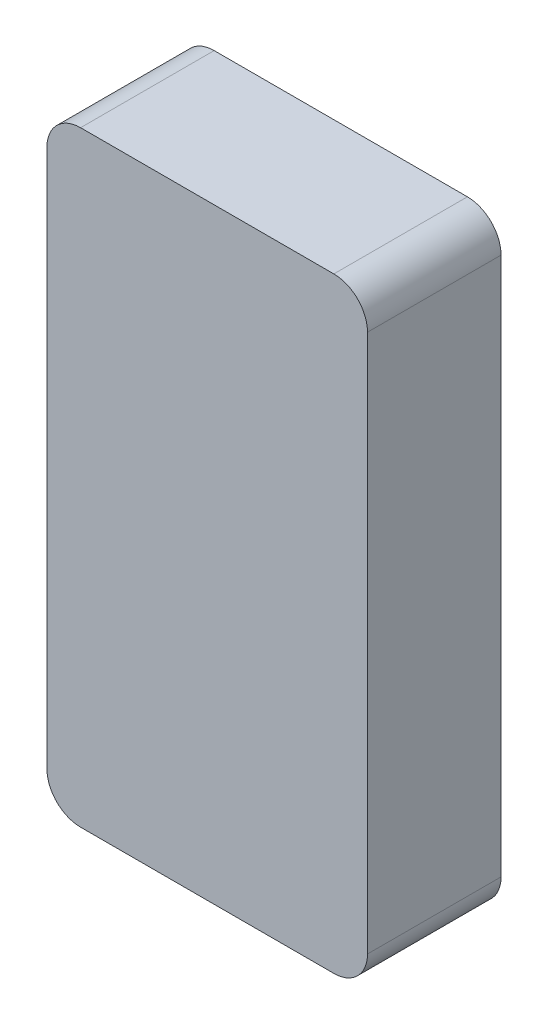
ISO-10303-21;
HEADER;
FILE_DESCRIPTION(('STEP AP214'),'2;1');
FILE_NAME('part.step','',(''),(''),'','','');
FILE_SCHEMA(('AUTOMOTIVE_DESIGN { 1 0 10303 214 1 1 1 1 }'));
ENDSEC;
DATA;
#1=APPLICATION_CONTEXT('core data for automotive mechanical design processes');
#2=APPLICATION_PROTOCOL_DEFINITION('international standard','automotive_design',2000,#1);
#3=PRODUCT_CONTEXT('',#1,'mechanical');
#4=PRODUCT('Part','Part','',(#3));
#5=PRODUCT_RELATED_PRODUCT_CATEGORY('part','',(#4));
#6=PRODUCT_DEFINITION_FORMATION('','',#4);
#7=PRODUCT_DEFINITION_CONTEXT('part definition',#1,'design');
#8=PRODUCT_DEFINITION('design','',#6,#7);
#9=PRODUCT_DEFINITION_SHAPE('','',#8);
#10=(LENGTH_UNIT() NAMED_UNIT(*) SI_UNIT(.MILLI.,.METRE.));
#11=(NAMED_UNIT(*) PLANE_ANGLE_UNIT() SI_UNIT($,.RADIAN.));
#12=(NAMED_UNIT(*) SI_UNIT($,.STERADIAN.) SOLID_ANGLE_UNIT());
#13=UNCERTAINTY_MEASURE_WITH_UNIT(LENGTH_MEASURE(1.E-05),#10,'distance_accuracy_value','');
#14=(GEOMETRIC_REPRESENTATION_CONTEXT(3) GLOBAL_UNCERTAINTY_ASSIGNED_CONTEXT((#13)) GLOBAL_UNIT_ASSIGNED_CONTEXT((#10,
#11,#12)) REPRESENTATION_CONTEXT('',''));
#15=CARTESIAN_POINT('',(0.,0.,0.));
#16=DIRECTION('',(0.,0.,1.));
#17=DIRECTION('',(1.,0.,0.));
#18=AXIS2_PLACEMENT_3D('',#15,#16,#17);
#19=CARTESIAN_POINT('',(0.,0.,1.984375));
#20=DIRECTION('',(1.,0.,0.));
#21=DIRECTION('',(0.,0.,-1.));
#22=AXIS2_PLACEMENT_3D('',#19,#20,#21);
#23=PLANE('',#22);
#24=DIRECTION('',(0.,-1.,0.));
#25=VECTOR('',#24,1.);
#26=CARTESIAN_POINT('',(0.,0.,0.));
#27=LINE('',#26,#25);
#28=CARTESIAN_POINT('',(0.,8.5,0.));
#29=VERTEX_POINT('',#28);
#30=CARTESIAN_POINT('',(0.,0.5,0.));
#31=VERTEX_POINT('',#30);
#32=EDGE_CURVE('E168',#29,#31,#27,.T.);
#33=ORIENTED_EDGE('',*,*,#32,.T.);
#34=DIRECTION('',(0.,0.,-1.));
#35=VECTOR('',#34,1.);
#36=CARTESIAN_POINT('',(0.,0.5,1.984375));
#37=LINE('',#36,#35);
#38=CARTESIAN_POINT('',(0.,0.5,1.984375));
#39=VERTEX_POINT('',#38);
#40=EDGE_CURVE('E11',#31,#39,#37,.F.);
#41=ORIENTED_EDGE('',*,*,#40,.T.);
#42=DIRECTION('',(0.,-1.,0.));
#43=VECTOR('',#42,1.);
#44=CARTESIAN_POINT('',(0.,0.,1.984375));
#45=LINE('',#44,#43);
#46=CARTESIAN_POINT('',(0.,8.5,1.984375));
#47=VERTEX_POINT('',#46);
#48=EDGE_CURVE('E123',#47,#39,#45,.T.);
#49=ORIENTED_EDGE('',*,*,#48,.F.);
#50=DIRECTION('',(0.,0.,-1.));
#51=VECTOR('',#50,1.);
#52=CARTESIAN_POINT('',(0.,8.5,1.984375));
#53=LINE('',#52,#51);
#54=EDGE_CURVE('E139',#47,#29,#53,.T.);
#55=ORIENTED_EDGE('',*,*,#54,.T.);
#56=EDGE_LOOP('',(#33,#41,#49,#55));
#57=FACE_BOUND('',#56,.T.);
#58=ADVANCED_FACE('F31',(#57),#23,.F.);
#59=CARTESIAN_POINT('',(0.,0.,1.984375));
#60=DIRECTION('',(0.,1.,0.));
#61=DIRECTION('',(0.,0.,1.));
#62=AXIS2_PLACEMENT_3D('',#59,#60,#61);
#63=PLANE('',#62);
#64=DIRECTION('',(1.,0.,0.));
#65=VECTOR('',#64,1.);
#66=CARTESIAN_POINT('',(0.,0.,0.));
#67=LINE('',#66,#65);
#68=CARTESIAN_POINT('',(0.5,0.,0.));
#69=VERTEX_POINT('',#68);
#70=CARTESIAN_POINT('',(4.2625,0.,0.));
#71=VERTEX_POINT('',#70);
#72=EDGE_CURVE('E128',#69,#71,#67,.T.);
#73=ORIENTED_EDGE('',*,*,#72,.T.);
#74=DIRECTION('',(0.,0.,-1.));
#75=VECTOR('',#74,1.);
#76=CARTESIAN_POINT('',(4.2625,0.,1.984375));
#77=LINE('',#76,#75);
#78=CARTESIAN_POINT('',(4.2625,0.,1.984375));
#79=VERTEX_POINT('',#78);
#80=EDGE_CURVE('E52',#71,#79,#77,.F.);
#81=ORIENTED_EDGE('',*,*,#80,.T.);
#82=DIRECTION('',(1.,0.,0.));
#83=VECTOR('',#82,1.);
#84=CARTESIAN_POINT('',(0.,0.,1.984375));
#85=LINE('',#84,#83);
#86=CARTESIAN_POINT('',(0.5,0.,1.984375));
#87=VERTEX_POINT('',#86);
#88=EDGE_CURVE('E126',#87,#79,#85,.T.);
#89=ORIENTED_EDGE('',*,*,#88,.F.);
#90=DIRECTION('',(0.,0.,-1.));
#91=VECTOR('',#90,1.);
#92=CARTESIAN_POINT('',(0.5,0.,1.984375));
#93=LINE('',#92,#91);
#94=EDGE_CURVE('E149',#87,#69,#93,.T.);
#95=ORIENTED_EDGE('',*,*,#94,.T.);
#96=EDGE_LOOP('',(#73,#81,#89,#95));
#97=FACE_BOUND('',#96,.T.);
#98=ADVANCED_FACE('F166',(#97),#63,.F.);
#99=CARTESIAN_POINT('',(4.7625,0.,1.984375));
#100=DIRECTION('',(-1.,0.,0.));
#101=DIRECTION('',(0.,0.,1.));
#102=AXIS2_PLACEMENT_3D('',#99,#100,#101);
#103=PLANE('',#102);
#104=DIRECTION('',(0.,1.,0.));
#105=VECTOR('',#104,1.);
#106=CARTESIAN_POINT('',(4.7625,0.,1.984375));
#107=LINE('',#106,#105);
#108=CARTESIAN_POINT('',(4.7625,0.5,1.984375));
#109=VERTEX_POINT('',#108);
#110=CARTESIAN_POINT('',(4.7625,8.5,1.984375));
#111=VERTEX_POINT('',#110);
#112=EDGE_CURVE('E158',#109,#111,#107,.T.);
#113=ORIENTED_EDGE('',*,*,#112,.F.);
#114=DIRECTION('',(0.,0.,-1.));
#115=VECTOR('',#114,1.);
#116=CARTESIAN_POINT('',(4.7625,0.5,1.984375));
#117=LINE('',#116,#115);
#118=CARTESIAN_POINT('',(4.7625,0.5,0.));
#119=VERTEX_POINT('',#118);
#120=EDGE_CURVE('E142',#109,#119,#117,.T.);
#121=ORIENTED_EDGE('',*,*,#120,.T.);
#122=DIRECTION('',(0.,1.,0.));
#123=VECTOR('',#122,1.);
#124=CARTESIAN_POINT('',(4.7625,0.,0.));
#125=LINE('',#124,#123);
#126=CARTESIAN_POINT('',(4.7625,8.5,0.));
#127=VERTEX_POINT('',#126);
#128=EDGE_CURVE('E124',#119,#127,#125,.T.);
#129=ORIENTED_EDGE('',*,*,#128,.T.);
#130=DIRECTION('',(0.,0.,-1.));
#131=VECTOR('',#130,1.);
#132=CARTESIAN_POINT('',(4.7625,8.5,1.984375));
#133=LINE('',#132,#131);
#134=EDGE_CURVE('E105',#127,#111,#133,.F.);
#135=ORIENTED_EDGE('',*,*,#134,.T.);
#136=EDGE_LOOP('',(#113,#121,#129,#135));
#137=FACE_BOUND('',#136,.T.);
#138=ADVANCED_FACE('F162',(#137),#103,.F.);
#139=CARTESIAN_POINT('',(0.,9.,1.984375));
#140=DIRECTION('',(0.,-1.,0.));
#141=DIRECTION('',(0.,0.,-1.));
#142=AXIS2_PLACEMENT_3D('',#139,#140,#141);
#143=PLANE('',#142);
#144=DIRECTION('',(-1.,0.,0.));
#145=VECTOR('',#144,1.);
#146=CARTESIAN_POINT('',(0.,9.,1.984375));
#147=LINE('',#146,#145);
#148=CARTESIAN_POINT('',(4.2625,9.,1.984375));
#149=VERTEX_POINT('',#148);
#150=CARTESIAN_POINT('',(0.5,9.,1.984375));
#151=VERTEX_POINT('',#150);
#152=EDGE_CURVE('E118',#149,#151,#147,.T.);
#153=ORIENTED_EDGE('',*,*,#152,.F.);
#154=DIRECTION('',(0.,0.,-1.));
#155=VECTOR('',#154,1.);
#156=CARTESIAN_POINT('',(4.2625,9.,1.984375));
#157=LINE('',#156,#155);
#158=CARTESIAN_POINT('',(4.2625,9.,0.));
#159=VERTEX_POINT('',#158);
#160=EDGE_CURVE('E103',#149,#159,#157,.T.);
#161=ORIENTED_EDGE('',*,*,#160,.T.);
#162=DIRECTION('',(-1.,0.,0.));
#163=VECTOR('',#162,1.);
#164=CARTESIAN_POINT('',(0.,9.,0.));
#165=LINE('',#164,#163);
#166=CARTESIAN_POINT('',(0.5,9.,0.));
#167=VERTEX_POINT('',#166);
#168=EDGE_CURVE('E115',#159,#167,#165,.T.);
#169=ORIENTED_EDGE('',*,*,#168,.T.);
#170=DIRECTION('',(0.,0.,-1.));
#171=VECTOR('',#170,1.);
#172=CARTESIAN_POINT('',(0.5,9.,1.984375));
#173=LINE('',#172,#171);
#174=EDGE_CURVE('E119',#167,#151,#173,.F.);
#175=ORIENTED_EDGE('',*,*,#174,.T.);
#176=EDGE_LOOP('',(#153,#161,#169,#175));
#177=FACE_BOUND('',#176,.T.);
#178=ADVANCED_FACE('F114',(#177),#143,.F.);
#179=CARTESIAN_POINT('',(0.,9.,1.984375));
#180=DIRECTION('',(0.,0.,-1.));
#181=DIRECTION('',(-1.,0.,0.));
#182=AXIS2_PLACEMENT_3D('',#179,#180,#181);
#183=PLANE('',#182);
#184=ORIENTED_EDGE('',*,*,#88,.T.);
#185=CARTESIAN_POINT('',(4.2625,0.5,1.984375));
#186=DIRECTION('',(0.,0.,-1.));
#187=DIRECTION('',(-1.,0.,0.));
#188=AXIS2_PLACEMENT_3D('',#185,#186,#187);
#189=CIRCLE('',#188,0.5);
#190=EDGE_CURVE('E39',#79,#109,#189,.F.);
#191=ORIENTED_EDGE('',*,*,#190,.T.);
#192=ORIENTED_EDGE('',*,*,#112,.T.);
#193=CARTESIAN_POINT('',(4.2625,8.5,1.984375));
#194=DIRECTION('',(0.,0.,-1.));
#195=DIRECTION('',(-1.,0.,0.));
#196=AXIS2_PLACEMENT_3D('',#193,#194,#195);
#197=CIRCLE('',#196,0.5);
#198=EDGE_CURVE('E137',#111,#149,#197,.F.);
#199=ORIENTED_EDGE('',*,*,#198,.T.);
#200=ORIENTED_EDGE('',*,*,#152,.T.);
#201=CARTESIAN_POINT('',(0.5,8.5,1.984375));
#202=DIRECTION('',(0.,0.,-1.));
#203=DIRECTION('',(-1.,0.,0.));
#204=AXIS2_PLACEMENT_3D('',#201,#202,#203);
#205=CIRCLE('',#204,0.5);
#206=EDGE_CURVE('E135',#151,#47,#205,.F.);
#207=ORIENTED_EDGE('',*,*,#206,.T.);
#208=ORIENTED_EDGE('',*,*,#48,.T.);
#209=CARTESIAN_POINT('',(0.5,0.5,1.984375));
#210=DIRECTION('',(0.,0.,-1.));
#211=DIRECTION('',(-1.,0.,0.));
#212=AXIS2_PLACEMENT_3D('',#209,#210,#211);
#213=CIRCLE('',#212,0.5);
#214=EDGE_CURVE('E153',#39,#87,#213,.F.);
#215=ORIENTED_EDGE('',*,*,#214,.T.);
#216=EDGE_LOOP('',(#184,#191,#192,#199,#200,#207,#208,#215));
#217=FACE_BOUND('',#216,.T.);
#218=ADVANCED_FACE('F157',(#217),#183,.F.);
#219=CARTESIAN_POINT('',(0.,9.,0.));
#220=DIRECTION('',(0.,0.,-1.));
#221=DIRECTION('',(-1.,0.,0.));
#222=AXIS2_PLACEMENT_3D('',#219,#220,#221);
#223=PLANE('',#222);
#224=ORIENTED_EDGE('',*,*,#128,.F.);
#225=CARTESIAN_POINT('',(4.2625,0.5,0.));
#226=DIRECTION('',(0.,0.,-1.));
#227=DIRECTION('',(-1.,0.,0.));
#228=AXIS2_PLACEMENT_3D('',#225,#226,#227);
#229=CIRCLE('',#228,0.5);
#230=EDGE_CURVE('E147',#119,#71,#229,.T.);
#231=ORIENTED_EDGE('',*,*,#230,.T.);
#232=ORIENTED_EDGE('',*,*,#72,.F.);
#233=CARTESIAN_POINT('',(0.5,0.5,0.));
#234=DIRECTION('',(0.,0.,-1.));
#235=DIRECTION('',(-1.,0.,0.));
#236=AXIS2_PLACEMENT_3D('',#233,#234,#235);
#237=CIRCLE('',#236,0.5);
#238=EDGE_CURVE('E145',#69,#31,#237,.T.);
#239=ORIENTED_EDGE('',*,*,#238,.T.);
#240=ORIENTED_EDGE('',*,*,#32,.F.);
#241=CARTESIAN_POINT('',(0.5,8.5,0.));
#242=DIRECTION('',(0.,0.,-1.));
#243=DIRECTION('',(-1.,0.,0.));
#244=AXIS2_PLACEMENT_3D('',#241,#242,#243);
#245=CIRCLE('',#244,0.5);
#246=EDGE_CURVE('E109',#29,#167,#245,.T.);
#247=ORIENTED_EDGE('',*,*,#246,.T.);
#248=ORIENTED_EDGE('',*,*,#168,.F.);
#249=CARTESIAN_POINT('',(4.2625,8.5,0.));
#250=DIRECTION('',(0.,0.,-1.));
#251=DIRECTION('',(-1.,0.,0.));
#252=AXIS2_PLACEMENT_3D('',#249,#250,#251);
#253=CIRCLE('',#252,0.5);
#254=EDGE_CURVE('E99',#159,#127,#253,.T.);
#255=ORIENTED_EDGE('',*,*,#254,.T.);
#256=EDGE_LOOP('',(#224,#231,#232,#239,#240,#247,#248,#255));
#257=FACE_BOUND('',#256,.T.);
#258=ADVANCED_FACE('F121',(#257),#223,.T.);
#259=CARTESIAN_POINT('',(4.2625,8.5,1.984375));
#260=DIRECTION('',(0.,0.,-1.));
#261=DIRECTION('',(-1.,0.,0.));
#262=AXIS2_PLACEMENT_3D('',#259,#260,#261);
#263=CYLINDRICAL_SURFACE('',#262,0.5);
#264=ORIENTED_EDGE('',*,*,#198,.F.);
#265=ORIENTED_EDGE('',*,*,#134,.F.);
#266=ORIENTED_EDGE('',*,*,#254,.F.);
#267=ORIENTED_EDGE('',*,*,#160,.F.);
#268=EDGE_LOOP('',(#264,#265,#266,#267));
#269=FACE_BOUND('',#268,.T.);
#270=ADVANCED_FACE('F102',(#269),#263,.T.);
#271=CARTESIAN_POINT('',(0.5,8.5,1.984375));
#272=DIRECTION('',(0.,0.,-1.));
#273=DIRECTION('',(-1.,0.,0.));
#274=AXIS2_PLACEMENT_3D('',#271,#272,#273);
#275=CYLINDRICAL_SURFACE('',#274,0.5);
#276=ORIENTED_EDGE('',*,*,#206,.F.);
#277=ORIENTED_EDGE('',*,*,#174,.F.);
#278=ORIENTED_EDGE('',*,*,#246,.F.);
#279=ORIENTED_EDGE('',*,*,#54,.F.);
#280=EDGE_LOOP('',(#276,#277,#278,#279));
#281=FACE_BOUND('',#280,.T.);
#282=ADVANCED_FACE('F175',(#281),#275,.T.);
#283=CARTESIAN_POINT('',(4.2625,0.5,1.984375));
#284=DIRECTION('',(0.,0.,-1.));
#285=DIRECTION('',(-1.,0.,0.));
#286=AXIS2_PLACEMENT_3D('',#283,#284,#285);
#287=CYLINDRICAL_SURFACE('',#286,0.5);
#288=ORIENTED_EDGE('',*,*,#190,.F.);
#289=ORIENTED_EDGE('',*,*,#80,.F.);
#290=ORIENTED_EDGE('',*,*,#230,.F.);
#291=ORIENTED_EDGE('',*,*,#120,.F.);
#292=EDGE_LOOP('',(#288,#289,#290,#291));
#293=FACE_BOUND('',#292,.T.);
#294=ADVANCED_FACE('F164',(#293),#287,.T.);
#295=CARTESIAN_POINT('',(0.5,0.5,1.984375));
#296=DIRECTION('',(0.,0.,-1.));
#297=DIRECTION('',(-1.,0.,0.));
#298=AXIS2_PLACEMENT_3D('',#295,#296,#297);
#299=CYLINDRICAL_SURFACE('',#298,0.5);
#300=ORIENTED_EDGE('',*,*,#214,.F.);
#301=ORIENTED_EDGE('',*,*,#40,.F.);
#302=ORIENTED_EDGE('',*,*,#238,.F.);
#303=ORIENTED_EDGE('',*,*,#94,.F.);
#304=EDGE_LOOP('',(#300,#301,#302,#303));
#305=FACE_BOUND('',#304,.T.);
#306=ADVANCED_FACE('F33',(#305),#299,.T.);
#307=CLOSED_SHELL('',(#58,#98,#138,#178,#218,#258,#270,#282,#294,#306));
#308=MANIFOLD_SOLID_BREP('B2',#307);
#309=ADVANCED_BREP_SHAPE_REPRESENTATION('',(#18,#308),#14);
#310=SHAPE_DEFINITION_REPRESENTATION(#9,#309);
ENDSEC;
END-ISO-10303-21;
